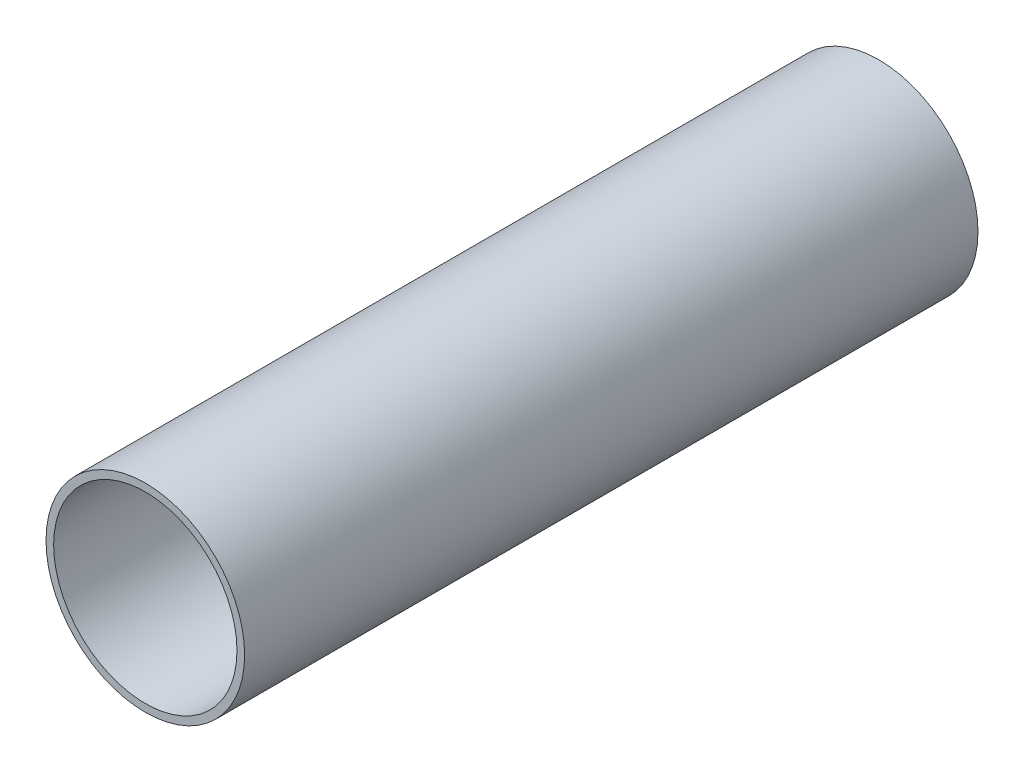
ISO-10303-21;
HEADER;
FILE_DESCRIPTION(('STEP AP214'),'2;1');
FILE_NAME('part.step','',(''),(''),'','','');
FILE_SCHEMA(('AUTOMOTIVE_DESIGN { 1 0 10303 214 1 1 1 1 }'));
ENDSEC;
DATA;
#1=APPLICATION_CONTEXT('core data for automotive mechanical design processes');
#2=APPLICATION_PROTOCOL_DEFINITION('international standard','automotive_design',2000,#1);
#3=PRODUCT_CONTEXT('',#1,'mechanical');
#4=PRODUCT('Part','Part','',(#3));
#5=PRODUCT_RELATED_PRODUCT_CATEGORY('part','',(#4));
#6=PRODUCT_DEFINITION_FORMATION('','',#4);
#7=PRODUCT_DEFINITION_CONTEXT('part definition',#1,'design');
#8=PRODUCT_DEFINITION('design','',#6,#7);
#9=PRODUCT_DEFINITION_SHAPE('','',#8);
#10=(LENGTH_UNIT() NAMED_UNIT(*) SI_UNIT(.MILLI.,.METRE.));
#11=(NAMED_UNIT(*) PLANE_ANGLE_UNIT() SI_UNIT($,.RADIAN.));
#12=(NAMED_UNIT(*) SI_UNIT($,.STERADIAN.) SOLID_ANGLE_UNIT());
#13=UNCERTAINTY_MEASURE_WITH_UNIT(LENGTH_MEASURE(1.E-05),#10,'distance_accuracy_value','');
#14=(GEOMETRIC_REPRESENTATION_CONTEXT(3) GLOBAL_UNCERTAINTY_ASSIGNED_CONTEXT((#13)) GLOBAL_UNIT_ASSIGNED_CONTEXT((#10,
#11,#12)) REPRESENTATION_CONTEXT('',''));
#15=CARTESIAN_POINT('',(0.,0.,0.));
#16=DIRECTION('',(0.,0.,1.));
#17=DIRECTION('',(1.,0.,0.));
#18=AXIS2_PLACEMENT_3D('',#15,#16,#17);
#19=CARTESIAN_POINT('',(0.,0.,609.6));
#20=DIRECTION('',(0.,0.,1.));
#21=DIRECTION('',(1.,0.,0.));
#22=AXIS2_PLACEMENT_3D('',#19,#20,#21);
#23=PLANE('',#22);
#24=CARTESIAN_POINT('',(0.,0.,609.6));
#25=DIRECTION('',(0.,0.,1.));
#26=DIRECTION('',(1.,0.,0.));
#27=AXIS2_PLACEMENT_3D('',#24,#25,#26);
#28=CIRCLE('',#27,82.55);
#29=CARTESIAN_POINT('',(-82.55,0.,609.6));
#30=VERTEX_POINT('',#29);
#31=EDGE_CURVE('E10',#30,#30,#28,.T.);
#32=ORIENTED_EDGE('',*,*,#31,.T.);
#33=EDGE_LOOP('',(#32));
#34=FACE_BOUND('',#33,.T.);
#35=CARTESIAN_POINT('',(0.,0.,609.6));
#36=DIRECTION('',(0.,0.,1.));
#37=DIRECTION('',(1.,0.,0.));
#38=AXIS2_PLACEMENT_3D('',#35,#36,#37);
#39=CIRCLE('',#38,76.2);
#40=CARTESIAN_POINT('',(-76.2,0.,609.6));
#41=VERTEX_POINT('',#40);
#42=EDGE_CURVE('E44',#41,#41,#39,.T.);
#43=ORIENTED_EDGE('',*,*,#42,.F.);
#44=EDGE_LOOP('',(#43));
#45=FACE_BOUND('',#44,.T.);
#46=ADVANCED_FACE('F33',(#34,#45),#23,.T.);
#47=CARTESIAN_POINT('',(0.,0.,0.));
#48=DIRECTION('',(0.,0.,1.));
#49=DIRECTION('',(1.,0.,0.));
#50=AXIS2_PLACEMENT_3D('',#47,#48,#49);
#51=PLANE('',#50);
#52=CARTESIAN_POINT('',(0.,0.,0.));
#53=DIRECTION('',(0.,0.,1.));
#54=DIRECTION('',(1.,0.,0.));
#55=AXIS2_PLACEMENT_3D('',#52,#53,#54);
#56=CIRCLE('',#55,82.55);
#57=CARTESIAN_POINT('',(-82.55,0.,0.));
#58=VERTEX_POINT('',#57);
#59=EDGE_CURVE('E37',#58,#58,#56,.T.);
#60=ORIENTED_EDGE('',*,*,#59,.F.);
#61=EDGE_LOOP('',(#60));
#62=FACE_BOUND('',#61,.T.);
#63=CARTESIAN_POINT('',(0.,0.,0.));
#64=DIRECTION('',(0.,0.,1.));
#65=DIRECTION('',(1.,0.,0.));
#66=AXIS2_PLACEMENT_3D('',#63,#64,#65);
#67=CIRCLE('',#66,76.2);
#68=CARTESIAN_POINT('',(-76.2,0.,0.));
#69=VERTEX_POINT('',#68);
#70=EDGE_CURVE('E46',#69,#69,#67,.T.);
#71=ORIENTED_EDGE('',*,*,#70,.T.);
#72=EDGE_LOOP('',(#71));
#73=FACE_BOUND('',#72,.T.);
#74=ADVANCED_FACE('F56',(#62,#73),#51,.F.);
#75=CARTESIAN_POINT('',(0.,0.,609.6));
#76=DIRECTION('',(0.,0.,-1.));
#77=DIRECTION('',(-1.,0.,0.));
#78=AXIS2_PLACEMENT_3D('',#75,#76,#77);
#79=CYLINDRICAL_SURFACE('',#78,82.55);
#80=CARTESIAN_POINT('',(-82.55,0.,609.6));
#81=CARTESIAN_POINT('',(-82.55,0.,603.25));
#82=CARTESIAN_POINT('',(-82.55,0.,596.9));
#83=CARTESIAN_POINT('',(-82.55,0.,584.2));
#84=CARTESIAN_POINT('',(-82.55,0.,577.85));
#85=CARTESIAN_POINT('',(-82.55,0.,565.15));
#86=CARTESIAN_POINT('',(-82.55,0.,558.8));
#87=CARTESIAN_POINT('',(-82.55,0.,546.1));
#88=CARTESIAN_POINT('',(-82.55,0.,539.75));
#89=CARTESIAN_POINT('',(-82.55,0.,527.05));
#90=CARTESIAN_POINT('',(-82.55,0.,520.7));
#91=CARTESIAN_POINT('',(-82.55,0.,508.));
#92=CARTESIAN_POINT('',(-82.55,0.,501.65));
#93=CARTESIAN_POINT('',(-82.55,0.,488.95));
#94=CARTESIAN_POINT('',(-82.55,0.,482.6));
#95=CARTESIAN_POINT('',(-82.55,0.,469.9));
#96=CARTESIAN_POINT('',(-82.55,0.,463.55));
#97=CARTESIAN_POINT('',(-82.55,0.,450.85));
#98=CARTESIAN_POINT('',(-82.55,0.,444.5));
#99=CARTESIAN_POINT('',(-82.55,0.,431.8));
#100=CARTESIAN_POINT('',(-82.55,0.,425.45));
#101=CARTESIAN_POINT('',(-82.55,0.,412.75));
#102=CARTESIAN_POINT('',(-82.55,0.,406.4));
#103=CARTESIAN_POINT('',(-82.55,0.,393.7));
#104=CARTESIAN_POINT('',(-82.55,0.,387.35));
#105=CARTESIAN_POINT('',(-82.55,0.,374.65));
#106=CARTESIAN_POINT('',(-82.55,0.,368.3));
#107=CARTESIAN_POINT('',(-82.55,0.,355.6));
#108=CARTESIAN_POINT('',(-82.55,0.,349.25));
#109=CARTESIAN_POINT('',(-82.55,0.,336.55));
#110=CARTESIAN_POINT('',(-82.55,0.,330.2));
#111=CARTESIAN_POINT('',(-82.55,0.,317.5));
#112=CARTESIAN_POINT('',(-82.55,0.,311.15));
#113=CARTESIAN_POINT('',(-82.55,0.,298.45));
#114=CARTESIAN_POINT('',(-82.55,0.,292.1));
#115=CARTESIAN_POINT('',(-82.55,0.,279.4));
#116=CARTESIAN_POINT('',(-82.55,0.,273.05));
#117=CARTESIAN_POINT('',(-82.55,0.,260.35));
#118=CARTESIAN_POINT('',(-82.55,0.,254.));
#119=CARTESIAN_POINT('',(-82.55,0.,241.3));
#120=CARTESIAN_POINT('',(-82.55,0.,234.95));
#121=CARTESIAN_POINT('',(-82.55,0.,222.25));
#122=CARTESIAN_POINT('',(-82.55,0.,215.9));
#123=CARTESIAN_POINT('',(-82.55,0.,203.2));
#124=CARTESIAN_POINT('',(-82.55,0.,196.85));
#125=CARTESIAN_POINT('',(-82.55,0.,184.15));
#126=CARTESIAN_POINT('',(-82.55,0.,177.8));
#127=CARTESIAN_POINT('',(-82.55,0.,165.1));
#128=CARTESIAN_POINT('',(-82.55,0.,158.75));
#129=CARTESIAN_POINT('',(-82.55,0.,146.05));
#130=CARTESIAN_POINT('',(-82.55,0.,139.7));
#131=CARTESIAN_POINT('',(-82.55,0.,127.));
#132=CARTESIAN_POINT('',(-82.55,0.,120.65));
#133=CARTESIAN_POINT('',(-82.55,0.,107.95));
#134=CARTESIAN_POINT('',(-82.55,0.,101.6));
#135=CARTESIAN_POINT('',(-82.55,0.,88.9));
#136=CARTESIAN_POINT('',(-82.55,0.,82.5500000000001));
#137=CARTESIAN_POINT('',(-82.55,0.,69.85));
#138=CARTESIAN_POINT('',(-82.55,0.,63.5));
#139=CARTESIAN_POINT('',(-82.55,0.,50.8));
#140=CARTESIAN_POINT('',(-82.55,0.,44.45));
#141=CARTESIAN_POINT('',(-82.55,0.,31.75));
#142=CARTESIAN_POINT('',(-82.55,0.,25.4));
#143=CARTESIAN_POINT('',(-82.55,0.,12.7));
#144=CARTESIAN_POINT('',(-82.55,0.,6.35000000000001));
#145=CARTESIAN_POINT('',(-82.55,0.,0.));
#146=B_SPLINE_CURVE_WITH_KNOTS('',3,(#80,#81,#82,#83,#84,#85,#86,#87,#88,#89,#90,#91,#92,#93,
#94,#95,#96,#97,#98,#99,#100,#101,#102,#103,#104,#105,#106,#107,#108,#109,#110,#111,#112,#113,
#114,#115,#116,#117,#118,#119,#120,#121,#122,#123,#124,#125,#126,#127,#128,#129,#130,#131,#132,
#133,#134,#135,#136,#137,#138,#139,#140,#141,#142,#143,#144,#145),.UNSPECIFIED.,.F.,.F.,(4,2,2,
2,2,2,2,2,2,2,2,2,2,2,2,2,2,2,2,2,2,2,2,2,2,2,2,2,2,2,2,2,4),(0.,19.05,38.1,57.15,76.2,
95.2500000000001,114.3,133.35,152.4,171.45,190.5,209.55,228.6,247.65,266.7,285.75,304.8,323.85,
342.9,361.95,381.,400.05,419.1,438.15,457.2,476.25,495.3,514.35,533.4,552.45,571.5,590.55,
609.6),.UNSPECIFIED.);
#147=EDGE_CURVE('BSEAM35',#30,#58,#146,.T.);
#148=ORIENTED_EDGE('',*,*,#31,.F.);
#149=ORIENTED_EDGE('',*,*,#59,.T.);
#150=ORIENTED_EDGE('',*,*,#147,.T.);
#151=ORIENTED_EDGE('',*,*,#147,.F.);
#152=EDGE_LOOP('',(#148,#150,#149,#151));
#153=FACE_BOUND('',#152,.T.);
#154=ADVANCED_FACE('F35',(#153),#79,.T.);
#155=CARTESIAN_POINT('',(0.,0.,609.6));
#156=DIRECTION('',(0.,0.,-1.));
#157=DIRECTION('',(-1.,0.,0.));
#158=AXIS2_PLACEMENT_3D('',#155,#156,#157);
#159=CYLINDRICAL_SURFACE('',#158,76.2);
#160=CARTESIAN_POINT('',(-76.2,0.,609.6));
#161=CARTESIAN_POINT('',(-76.2,0.,603.25));
#162=CARTESIAN_POINT('',(-76.2,0.,596.9));
#163=CARTESIAN_POINT('',(-76.2,0.,584.2));
#164=CARTESIAN_POINT('',(-76.2,0.,577.85));
#165=CARTESIAN_POINT('',(-76.2,0.,565.15));
#166=CARTESIAN_POINT('',(-76.2,0.,558.8));
#167=CARTESIAN_POINT('',(-76.2,0.,546.1));
#168=CARTESIAN_POINT('',(-76.2,0.,539.75));
#169=CARTESIAN_POINT('',(-76.2,0.,527.05));
#170=CARTESIAN_POINT('',(-76.2,0.,520.7));
#171=CARTESIAN_POINT('',(-76.2,0.,508.));
#172=CARTESIAN_POINT('',(-76.2,0.,501.65));
#173=CARTESIAN_POINT('',(-76.2,0.,488.95));
#174=CARTESIAN_POINT('',(-76.2,0.,482.6));
#175=CARTESIAN_POINT('',(-76.2,0.,469.9));
#176=CARTESIAN_POINT('',(-76.2,0.,463.55));
#177=CARTESIAN_POINT('',(-76.2,0.,450.85));
#178=CARTESIAN_POINT('',(-76.2,0.,444.5));
#179=CARTESIAN_POINT('',(-76.2,0.,431.8));
#180=CARTESIAN_POINT('',(-76.2,0.,425.45));
#181=CARTESIAN_POINT('',(-76.2,0.,412.75));
#182=CARTESIAN_POINT('',(-76.2,0.,406.4));
#183=CARTESIAN_POINT('',(-76.2,0.,393.7));
#184=CARTESIAN_POINT('',(-76.2,0.,387.35));
#185=CARTESIAN_POINT('',(-76.2,0.,374.65));
#186=CARTESIAN_POINT('',(-76.2,0.,368.3));
#187=CARTESIAN_POINT('',(-76.2,0.,355.6));
#188=CARTESIAN_POINT('',(-76.2,0.,349.25));
#189=CARTESIAN_POINT('',(-76.2,0.,336.55));
#190=CARTESIAN_POINT('',(-76.2,0.,330.2));
#191=CARTESIAN_POINT('',(-76.2,0.,317.5));
#192=CARTESIAN_POINT('',(-76.2,0.,311.15));
#193=CARTESIAN_POINT('',(-76.2,0.,298.45));
#194=CARTESIAN_POINT('',(-76.2,0.,292.1));
#195=CARTESIAN_POINT('',(-76.2,0.,279.4));
#196=CARTESIAN_POINT('',(-76.2,0.,273.05));
#197=CARTESIAN_POINT('',(-76.2,0.,260.35));
#198=CARTESIAN_POINT('',(-76.2,0.,254.));
#199=CARTESIAN_POINT('',(-76.2,0.,241.3));
#200=CARTESIAN_POINT('',(-76.2,0.,234.95));
#201=CARTESIAN_POINT('',(-76.2,0.,222.25));
#202=CARTESIAN_POINT('',(-76.2,0.,215.9));
#203=CARTESIAN_POINT('',(-76.2,0.,203.2));
#204=CARTESIAN_POINT('',(-76.2,0.,196.85));
#205=CARTESIAN_POINT('',(-76.2,0.,184.15));
#206=CARTESIAN_POINT('',(-76.2,0.,177.8));
#207=CARTESIAN_POINT('',(-76.2,0.,165.1));
#208=CARTESIAN_POINT('',(-76.2,0.,158.75));
#209=CARTESIAN_POINT('',(-76.2,0.,146.05));
#210=CARTESIAN_POINT('',(-76.2,0.,139.7));
#211=CARTESIAN_POINT('',(-76.2,0.,127.));
#212=CARTESIAN_POINT('',(-76.2,0.,120.65));
#213=CARTESIAN_POINT('',(-76.2,0.,107.95));
#214=CARTESIAN_POINT('',(-76.2,0.,101.6));
#215=CARTESIAN_POINT('',(-76.2,0.,88.9));
#216=CARTESIAN_POINT('',(-76.2,0.,82.5500000000001));
#217=CARTESIAN_POINT('',(-76.2,0.,69.85));
#218=CARTESIAN_POINT('',(-76.2,0.,63.5));
#219=CARTESIAN_POINT('',(-76.2,0.,50.8));
#220=CARTESIAN_POINT('',(-76.2,0.,44.45));
#221=CARTESIAN_POINT('',(-76.2,0.,31.75));
#222=CARTESIAN_POINT('',(-76.2,0.,25.4));
#223=CARTESIAN_POINT('',(-76.2,0.,12.7));
#224=CARTESIAN_POINT('',(-76.2,0.,6.35000000000001));
#225=CARTESIAN_POINT('',(-76.2,0.,0.));
#226=B_SPLINE_CURVE_WITH_KNOTS('',3,(#160,#161,#162,#163,#164,#165,#166,#167,#168,#169,#170,
#171,#172,#173,#174,#175,#176,#177,#178,#179,#180,#181,#182,#183,#184,#185,#186,#187,#188,#189,
#190,#191,#192,#193,#194,#195,#196,#197,#198,#199,#200,#201,#202,#203,#204,#205,#206,#207,#208,
#209,#210,#211,#212,#213,#214,#215,#216,#217,#218,#219,#220,#221,#222,#223,#224,#225),
.UNSPECIFIED.,.F.,.F.,(4,2,2,2,2,2,2,2,2,2,2,2,2,2,2,2,2,2,2,2,2,2,2,2,2,2,2,2,2,2,2,2,4),(0.,
19.05,38.1,57.15,76.2,95.2500000000001,114.3,133.35,152.4,171.45,190.5,209.55,228.6,247.65,
266.7,285.75,304.8,323.85,342.9,361.95,381.,400.05,419.1,438.15,457.2,476.25,495.3,514.35,533.4,
552.45,571.5,590.55,609.6),.UNSPECIFIED.);
#227=EDGE_CURVE('BSEAM52',#41,#69,#226,.T.);
#228=ORIENTED_EDGE('',*,*,#42,.T.);
#229=ORIENTED_EDGE('',*,*,#70,.F.);
#230=ORIENTED_EDGE('',*,*,#227,.T.);
#231=ORIENTED_EDGE('',*,*,#227,.F.);
#232=EDGE_LOOP('',(#228,#230,#229,#231));
#233=FACE_BOUND('',#232,.T.);
#234=ADVANCED_FACE('F52',(#233),#159,.F.);
#235=CLOSED_SHELL('',(#46,#74,#154,#234));
#236=MANIFOLD_SOLID_BREP('B2',#235);
#237=ADVANCED_BREP_SHAPE_REPRESENTATION('',(#18,#236),#14);
#238=SHAPE_DEFINITION_REPRESENTATION(#9,#237);
ENDSEC;
END-ISO-10303-21;
